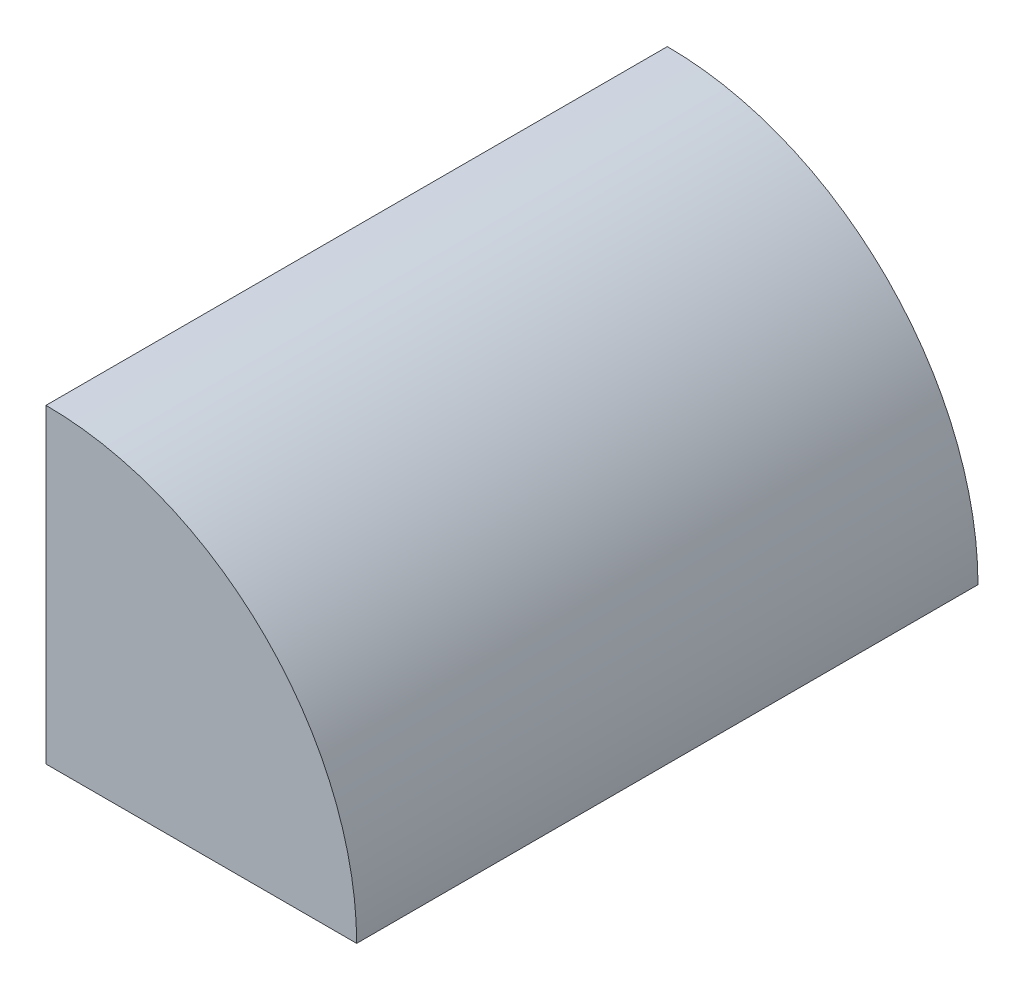
ISO-10303-21;
HEADER;
FILE_DESCRIPTION(('STEP AP214'),'2;1');
FILE_NAME('part.step','',(''),(''),'','','');
FILE_SCHEMA(('AUTOMOTIVE_DESIGN { 1 0 10303 214 1 1 1 1 }'));
ENDSEC;
DATA;
#1=APPLICATION_CONTEXT('core data for automotive mechanical design processes');
#2=APPLICATION_PROTOCOL_DEFINITION('international standard','automotive_design',2000,#1);
#3=PRODUCT_CONTEXT('',#1,'mechanical');
#4=PRODUCT('Part','Part','',(#3));
#5=PRODUCT_RELATED_PRODUCT_CATEGORY('part','',(#4));
#6=PRODUCT_DEFINITION_FORMATION('','',#4);
#7=PRODUCT_DEFINITION_CONTEXT('part definition',#1,'design');
#8=PRODUCT_DEFINITION('design','',#6,#7);
#9=PRODUCT_DEFINITION_SHAPE('','',#8);
#10=(LENGTH_UNIT() NAMED_UNIT(*) SI_UNIT(.MILLI.,.METRE.));
#11=(NAMED_UNIT(*) PLANE_ANGLE_UNIT() SI_UNIT($,.RADIAN.));
#12=(NAMED_UNIT(*) SI_UNIT($,.STERADIAN.) SOLID_ANGLE_UNIT());
#13=UNCERTAINTY_MEASURE_WITH_UNIT(LENGTH_MEASURE(1.E-05),#10,'distance_accuracy_value','');
#14=(GEOMETRIC_REPRESENTATION_CONTEXT(3) GLOBAL_UNCERTAINTY_ASSIGNED_CONTEXT((#13)) GLOBAL_UNIT_ASSIGNED_CONTEXT((#10,
#11,#12)) REPRESENTATION_CONTEXT('',''));
#15=CARTESIAN_POINT('',(0.,0.,0.));
#16=DIRECTION('',(0.,0.,1.));
#17=DIRECTION('',(1.,0.,0.));
#18=AXIS2_PLACEMENT_3D('',#15,#16,#17);
#19=CARTESIAN_POINT('',(0.,0.,50.));
#20=DIRECTION('',(0.,1.,0.));
#21=DIRECTION('',(0.,0.,1.));
#22=AXIS2_PLACEMENT_3D('',#19,#20,#21);
#23=PLANE('',#22);
#24=DIRECTION('',(1.,0.,0.));
#25=VECTOR('',#24,1.);
#26=CARTESIAN_POINT('',(0.,0.,0.));
#27=LINE('',#26,#25);
#28=CARTESIAN_POINT('',(0.,0.,0.));
#29=VERTEX_POINT('',#28);
#30=CARTESIAN_POINT('',(25.,0.,0.));
#31=VERTEX_POINT('',#30);
#32=EDGE_CURVE('E80',#29,#31,#27,.T.);
#33=ORIENTED_EDGE('',*,*,#32,.T.);
#34=DIRECTION('',(0.,0.,-1.));
#35=VECTOR('',#34,1.);
#36=CARTESIAN_POINT('',(25.,0.,50.));
#37=LINE('',#36,#35);
#38=CARTESIAN_POINT('',(25.,0.,50.));
#39=VERTEX_POINT('',#38);
#40=EDGE_CURVE('E11',#39,#31,#37,.T.);
#41=ORIENTED_EDGE('',*,*,#40,.F.);
#42=DIRECTION('',(1.,0.,0.));
#43=VECTOR('',#42,1.);
#44=CARTESIAN_POINT('',(0.,0.,50.));
#45=LINE('',#44,#43);
#46=CARTESIAN_POINT('',(0.,0.,50.));
#47=VERTEX_POINT('',#46);
#48=EDGE_CURVE('E73',#47,#39,#45,.T.);
#49=ORIENTED_EDGE('',*,*,#48,.F.);
#50=DIRECTION('',(0.,0.,-1.));
#51=VECTOR('',#50,1.);
#52=CARTESIAN_POINT('',(0.,0.,50.));
#53=LINE('',#52,#51);
#54=EDGE_CURVE('E81',#47,#29,#53,.T.);
#55=ORIENTED_EDGE('',*,*,#54,.T.);
#56=EDGE_LOOP('',(#33,#41,#49,#55));
#57=FACE_BOUND('',#56,.T.);
#58=ADVANCED_FACE('F33',(#57),#23,.F.);
#59=CARTESIAN_POINT('',(0.,0.,50.));
#60=DIRECTION('',(0.,0.,-1.));
#61=DIRECTION('',(-1.,0.,0.));
#62=AXIS2_PLACEMENT_3D('',#59,#60,#61);
#63=CYLINDRICAL_SURFACE('',#62,25.);
#64=CARTESIAN_POINT('',(0.,0.,0.));
#65=DIRECTION('',(0.,0.,1.));
#66=DIRECTION('',(1.,0.,0.));
#67=AXIS2_PLACEMENT_3D('',#64,#65,#66);
#68=CIRCLE('',#67,25.);
#69=CARTESIAN_POINT('',(0.,25.,0.));
#70=VERTEX_POINT('',#69);
#71=EDGE_CURVE('E61',#31,#70,#68,.T.);
#72=ORIENTED_EDGE('',*,*,#71,.T.);
#73=DIRECTION('',(0.,0.,-1.));
#74=VECTOR('',#73,1.);
#75=CARTESIAN_POINT('',(0.,25.,50.));
#76=LINE('',#75,#74);
#77=CARTESIAN_POINT('',(0.,25.,50.));
#78=VERTEX_POINT('',#77);
#79=EDGE_CURVE('E41',#78,#70,#76,.T.);
#80=ORIENTED_EDGE('',*,*,#79,.F.);
#81=CARTESIAN_POINT('',(0.,0.,50.));
#82=DIRECTION('',(0.,0.,1.));
#83=DIRECTION('',(1.,0.,0.));
#84=AXIS2_PLACEMENT_3D('',#81,#82,#83);
#85=CIRCLE('',#84,25.);
#86=EDGE_CURVE('E69',#39,#78,#85,.T.);
#87=ORIENTED_EDGE('',*,*,#86,.F.);
#88=ORIENTED_EDGE('',*,*,#40,.T.);
#89=EDGE_LOOP('',(#72,#80,#87,#88));
#90=FACE_BOUND('',#89,.T.);
#91=ADVANCED_FACE('F70',(#90),#63,.T.);
#92=CARTESIAN_POINT('',(0.,25.,50.));
#93=DIRECTION('',(1.,0.,0.));
#94=DIRECTION('',(0.,0.,-1.));
#95=AXIS2_PLACEMENT_3D('',#92,#93,#94);
#96=PLANE('',#95);
#97=DIRECTION('',(0.,-1.,0.));
#98=VECTOR('',#97,1.);
#99=CARTESIAN_POINT('',(0.,25.,0.));
#100=LINE('',#99,#98);
#101=EDGE_CURVE('E66',#70,#29,#100,.T.);
#102=ORIENTED_EDGE('',*,*,#101,.T.);
#103=ORIENTED_EDGE('',*,*,#54,.F.);
#104=DIRECTION('',(0.,-1.,0.));
#105=VECTOR('',#104,1.);
#106=CARTESIAN_POINT('',(0.,25.,50.));
#107=LINE('',#106,#105);
#108=EDGE_CURVE('E49',#78,#47,#107,.T.);
#109=ORIENTED_EDGE('',*,*,#108,.F.);
#110=ORIENTED_EDGE('',*,*,#79,.T.);
#111=EDGE_LOOP('',(#102,#103,#109,#110));
#112=FACE_BOUND('',#111,.T.);
#113=ADVANCED_FACE('F92',(#112),#96,.F.);
#114=CARTESIAN_POINT('',(0.,0.,50.));
#115=DIRECTION('',(0.,0.,1.));
#116=DIRECTION('',(1.,0.,0.));
#117=AXIS2_PLACEMENT_3D('',#114,#115,#116);
#118=PLANE('',#117);
#119=ORIENTED_EDGE('',*,*,#48,.T.);
#120=ORIENTED_EDGE('',*,*,#86,.T.);
#121=ORIENTED_EDGE('',*,*,#108,.T.);
#122=EDGE_LOOP('',(#119,#120,#121));
#123=FACE_BOUND('',#122,.T.);
#124=ADVANCED_FACE('F76',(#123),#118,.T.);
#125=CARTESIAN_POINT('',(0.,0.,0.));
#126=DIRECTION('',(0.,0.,1.));
#127=DIRECTION('',(1.,0.,0.));
#128=AXIS2_PLACEMENT_3D('',#125,#126,#127);
#129=PLANE('',#128);
#130=CARTESIAN_POINT('',(10.8222144727599,9.69153292179389,0.));
#131=DIRECTION('',(0.,0.,-1.));
#132=DIRECTION('',(-1.,0.,0.));
#133=AXIS2_PLACEMENT_3D('',#130,#131,#132);
#134=CIRCLE('',#133,5.);
#135=CARTESIAN_POINT('',(5.82221447275994,9.69153292179389,0.));
#136=VERTEX_POINT('',#135);
#137=EDGE_CURVE('E87',#136,#136,#134,.T.);
#138=ORIENTED_EDGE('',*,*,#137,.F.);
#139=EDGE_LOOP('',(#138));
#140=FACE_BOUND('',#139,.T.);
#141=ORIENTED_EDGE('',*,*,#32,.F.);
#142=ORIENTED_EDGE('',*,*,#101,.F.);
#143=ORIENTED_EDGE('',*,*,#71,.F.);
#144=EDGE_LOOP('',(#141,#142,#143));
#145=FACE_BOUND('',#144,.T.);
#146=ADVANCED_FACE('F93',(#140,#145),#129,.F.);
#147=CARTESIAN_POINT('',(10.8222144727599,9.69153292179389,10.));
#148=DIRECTION('',(0.,0.,-1.));
#149=DIRECTION('',(-1.,0.,0.));
#150=AXIS2_PLACEMENT_3D('',#147,#148,#149);
#151=CYLINDRICAL_SURFACE('',#150,5.);
#152=CARTESIAN_POINT('',(10.8222144727599,9.69153292179389,10.));
#153=DIRECTION('',(0.,0.,-1.));
#154=DIRECTION('',(-1.,0.,0.));
#155=AXIS2_PLACEMENT_3D('',#152,#153,#154);
#156=CIRCLE('',#155,5.);
#157=CARTESIAN_POINT('',(5.82221447275994,9.69153292179389,10.));
#158=VERTEX_POINT('',#157);
#159=EDGE_CURVE('E83',#158,#158,#156,.T.);
#160=ORIENTED_EDGE('',*,*,#159,.F.);
#161=EDGE_LOOP('',(#160));
#162=FACE_BOUND('',#161,.T.);
#163=ORIENTED_EDGE('',*,*,#137,.T.);
#164=EDGE_LOOP('',(#163));
#165=FACE_BOUND('',#164,.T.);
#166=ADVANCED_FACE('F95',(#162,#165),#151,.F.);
#167=CARTESIAN_POINT('',(10.8222144727599,9.69153292179389,10.));
#168=DIRECTION('',(0.,0.,-1.));
#169=DIRECTION('',(-1.,0.,0.));
#170=AXIS2_PLACEMENT_3D('',#167,#168,#169);
#171=PLANE('',#170);
#172=ORIENTED_EDGE('',*,*,#159,.T.);
#173=EDGE_LOOP('',(#172));
#174=FACE_BOUND('',#173,.T.);
#175=ADVANCED_FACE('F102',(#174),#171,.T.);
#176=CLOSED_SHELL('',(#58,#91,#113,#124,#146,#166,#175));
#177=MANIFOLD_SOLID_BREP('B2',#176);
#178=ADVANCED_BREP_SHAPE_REPRESENTATION('',(#18,#177),#14);
#179=SHAPE_DEFINITION_REPRESENTATION(#9,#178);
ENDSEC;
END-ISO-10303-21;
